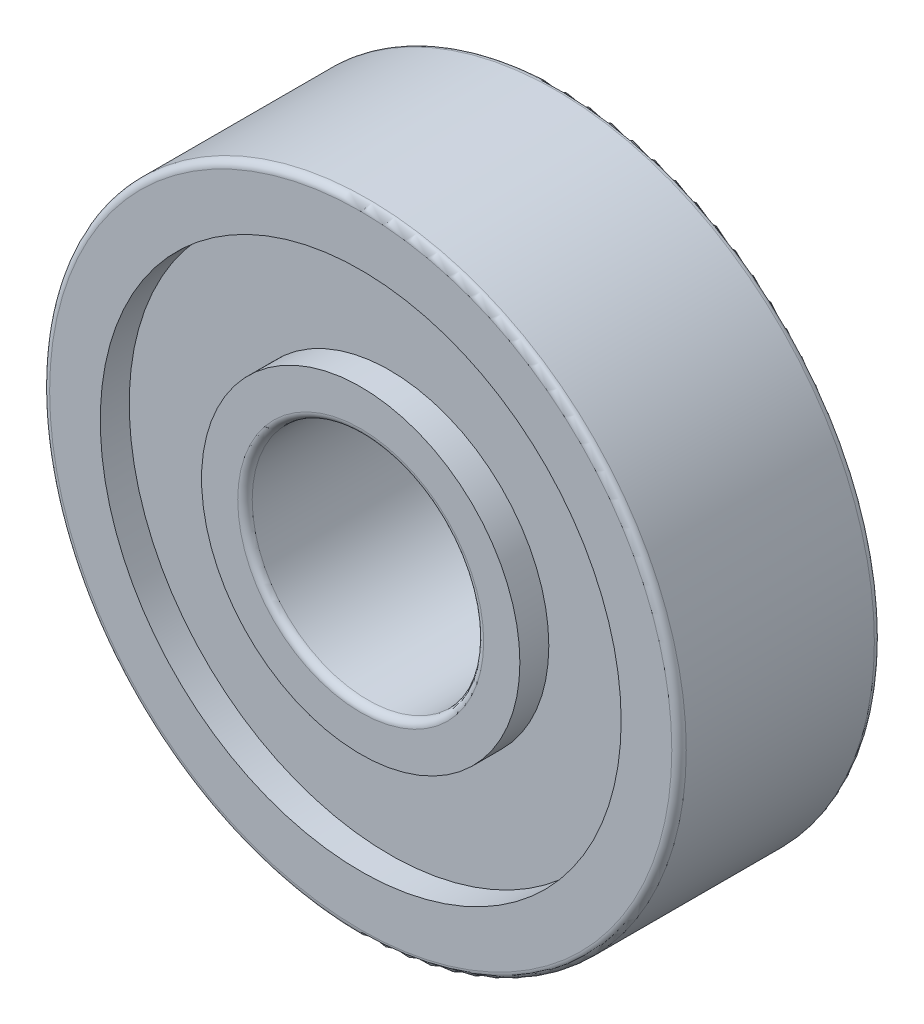
ISO-10303-21;
HEADER;
FILE_DESCRIPTION(('STEP AP214'),'2;1');
FILE_NAME('part.step','',(''),(''),'','','');
FILE_SCHEMA(('AUTOMOTIVE_DESIGN { 1 0 10303 214 1 1 1 1 }'));
ENDSEC;
DATA;
#1=APPLICATION_CONTEXT('core data for automotive mechanical design processes');
#2=APPLICATION_PROTOCOL_DEFINITION('international standard','automotive_design',2000,#1);
#3=PRODUCT_CONTEXT('',#1,'mechanical');
#4=PRODUCT('Part','Part','',(#3));
#5=PRODUCT_RELATED_PRODUCT_CATEGORY('part','',(#4));
#6=PRODUCT_DEFINITION_FORMATION('','',#4);
#7=PRODUCT_DEFINITION_CONTEXT('part definition',#1,'design');
#8=PRODUCT_DEFINITION('design','',#6,#7);
#9=PRODUCT_DEFINITION_SHAPE('','',#8);
#10=(LENGTH_UNIT() NAMED_UNIT(*) SI_UNIT(.MILLI.,.METRE.));
#11=(NAMED_UNIT(*) PLANE_ANGLE_UNIT() SI_UNIT($,.RADIAN.));
#12=(NAMED_UNIT(*) SI_UNIT($,.STERADIAN.) SOLID_ANGLE_UNIT());
#13=UNCERTAINTY_MEASURE_WITH_UNIT(LENGTH_MEASURE(1.E-05),#10,'distance_accuracy_value','');
#14=(GEOMETRIC_REPRESENTATION_CONTEXT(3) GLOBAL_UNCERTAINTY_ASSIGNED_CONTEXT((#13)) GLOBAL_UNIT_ASSIGNED_CONTEXT((#10,
#11,#12)) REPRESENTATION_CONTEXT('',''));
#15=CARTESIAN_POINT('',(0.,0.,0.));
#16=DIRECTION('',(0.,0.,1.));
#17=DIRECTION('',(1.,0.,0.));
#18=AXIS2_PLACEMENT_3D('',#15,#16,#17);
#19=CARTESIAN_POINT('',(0.,0.,0.));
#20=DIRECTION('',(0.,0.,1.));
#21=DIRECTION('',(1.,0.,0.));
#22=AXIS2_PLACEMENT_3D('',#19,#20,#21);
#23=PLANE('',#22);
#24=CARTESIAN_POINT('',(0.,0.,0.));
#25=DIRECTION('',(0.,0.,1.));
#26=DIRECTION('',(1.,0.,0.));
#27=AXIS2_PLACEMENT_3D('',#24,#25,#26);
#28=CIRCLE('',#27,4.25);
#29=CARTESIAN_POINT('',(4.25,0.,0.));
#30=VERTEX_POINT('',#29);
#31=EDGE_CURVE('E54',#30,#30,#28,.T.);
#32=ORIENTED_EDGE('',*,*,#31,.T.);
#33=EDGE_LOOP('',(#32));
#34=FACE_BOUND('',#33,.T.);
#35=CARTESIAN_POINT('',(0.,0.,0.));
#36=DIRECTION('',(0.,0.,-1.));
#37=DIRECTION('',(-1.,0.,0.));
#38=AXIS2_PLACEMENT_3D('',#35,#36,#37);
#39=CIRCLE('',#38,5.5);
#40=CARTESIAN_POINT('',(-5.5,0.,0.));
#41=VERTEX_POINT('',#40);
#42=EDGE_CURVE('E79',#41,#41,#39,.T.);
#43=ORIENTED_EDGE('',*,*,#42,.T.);
#44=EDGE_LOOP('',(#43));
#45=FACE_BOUND('',#44,.T.);
#46=ADVANCED_FACE('F28',(#34,#45),#23,.F.);
#47=CARTESIAN_POINT('',(0.,0.,7.));
#48=DIRECTION('',(0.,0.,1.));
#49=DIRECTION('',(1.,0.,0.));
#50=AXIS2_PLACEMENT_3D('',#47,#48,#49);
#51=PLANE('',#50);
#52=CARTESIAN_POINT('',(0.,0.,7.));
#53=DIRECTION('',(0.,0.,1.));
#54=DIRECTION('',(1.,0.,0.));
#55=AXIS2_PLACEMENT_3D('',#52,#53,#54);
#56=CIRCLE('',#55,4.25);
#57=CARTESIAN_POINT('',(4.25,0.,7.));
#58=VERTEX_POINT('',#57);
#59=EDGE_CURVE('E39',#58,#58,#56,.F.);
#60=ORIENTED_EDGE('',*,*,#59,.T.);
#61=EDGE_LOOP('',(#60));
#62=FACE_BOUND('',#61,.T.);
#63=CARTESIAN_POINT('',(0.,0.,7.));
#64=DIRECTION('',(0.,0.,1.));
#65=DIRECTION('',(1.,0.,0.));
#66=AXIS2_PLACEMENT_3D('',#63,#64,#65);
#67=CIRCLE('',#66,5.5);
#68=CARTESIAN_POINT('',(5.5,0.,7.));
#69=VERTEX_POINT('',#68);
#70=EDGE_CURVE('E67',#69,#69,#67,.T.);
#71=ORIENTED_EDGE('',*,*,#70,.T.);
#72=EDGE_LOOP('',(#71));
#73=FACE_BOUND('',#72,.T.);
#74=ADVANCED_FACE('F123',(#62,#73),#51,.T.);
#75=CARTESIAN_POINT('',(0.,0.,7.));
#76=DIRECTION('',(0.,0.,1.));
#77=DIRECTION('',(1.,0.,0.));
#78=AXIS2_PLACEMENT_3D('',#75,#76,#77);
#79=CIRCLE('',#78,9.);
#80=CARTESIAN_POINT('',(9.,0.,7.));
#81=VERTEX_POINT('',#80);
#82=EDGE_CURVE('E61',#81,#81,#79,.T.);
#83=ORIENTED_EDGE('',*,*,#82,.F.);
#84=EDGE_LOOP('',(#83));
#85=FACE_BOUND('',#84,.T.);
#86=CARTESIAN_POINT('',(0.,0.,7.));
#87=DIRECTION('',(0.,0.,1.));
#88=DIRECTION('',(1.,0.,0.));
#89=AXIS2_PLACEMENT_3D('',#86,#87,#88);
#90=CIRCLE('',#89,10.75);
#91=CARTESIAN_POINT('',(10.75,0.,7.));
#92=VERTEX_POINT('',#91);
#93=EDGE_CURVE('E43',#92,#92,#90,.T.);
#94=ORIENTED_EDGE('',*,*,#93,.T.);
#95=EDGE_LOOP('',(#94));
#96=FACE_BOUND('',#95,.T.);
#97=ADVANCED_FACE('F105',(#85,#96),#51,.T.);
#98=CARTESIAN_POINT('',(0.,0.,0.));
#99=DIRECTION('',(0.,0.,-1.));
#100=DIRECTION('',(-1.,0.,0.));
#101=AXIS2_PLACEMENT_3D('',#98,#99,#100);
#102=CIRCLE('',#101,9.);
#103=CARTESIAN_POINT('',(-9.,0.,0.));
#104=VERTEX_POINT('',#103);
#105=EDGE_CURVE('E73',#104,#104,#102,.T.);
#106=ORIENTED_EDGE('',*,*,#105,.F.);
#107=EDGE_LOOP('',(#106));
#108=FACE_BOUND('',#107,.T.);
#109=CARTESIAN_POINT('',(0.,0.,0.));
#110=DIRECTION('',(0.,0.,1.));
#111=DIRECTION('',(1.,0.,0.));
#112=AXIS2_PLACEMENT_3D('',#109,#110,#111);
#113=CIRCLE('',#112,10.75);
#114=CARTESIAN_POINT('',(10.75,0.,0.));
#115=VERTEX_POINT('',#114);
#116=EDGE_CURVE('E57',#115,#115,#113,.F.);
#117=ORIENTED_EDGE('',*,*,#116,.T.);
#118=EDGE_LOOP('',(#117));
#119=FACE_BOUND('',#118,.T.);
#120=ADVANCED_FACE('F101',(#108,#119),#23,.F.);
#121=CARTESIAN_POINT('',(0.,0.,7.));
#122=DIRECTION('',(0.,0.,-1.));
#123=DIRECTION('',(-1.,0.,0.));
#124=AXIS2_PLACEMENT_3D('',#121,#122,#123);
#125=CYLINDRICAL_SURFACE('',#124,11.);
#126=CARTESIAN_POINT('',(0.,0.,0.25));
#127=DIRECTION('',(0.,0.,1.));
#128=DIRECTION('',(1.,0.,0.));
#129=AXIS2_PLACEMENT_3D('',#126,#127,#128);
#130=CIRCLE('',#129,11.);
#131=CARTESIAN_POINT('',(11.,0.,0.25));
#132=VERTEX_POINT('',#131);
#133=EDGE_CURVE('E10',#132,#132,#130,.T.);
#134=ORIENTED_EDGE('',*,*,#133,.T.);
#135=EDGE_LOOP('',(#134));
#136=FACE_BOUND('',#135,.T.);
#137=CARTESIAN_POINT('',(0.,0.,6.75));
#138=DIRECTION('',(0.,0.,1.));
#139=DIRECTION('',(1.,0.,0.));
#140=AXIS2_PLACEMENT_3D('',#137,#138,#139);
#141=CIRCLE('',#140,11.);
#142=CARTESIAN_POINT('',(11.,0.,6.75));
#143=VERTEX_POINT('',#142);
#144=EDGE_CURVE('E35',#143,#143,#141,.F.);
#145=ORIENTED_EDGE('',*,*,#144,.T.);
#146=EDGE_LOOP('',(#145));
#147=FACE_BOUND('',#146,.T.);
#148=ADVANCED_FACE('F104',(#136,#147),#125,.T.);
#149=CARTESIAN_POINT('',(0.,0.,7.));
#150=DIRECTION('',(0.,0.,-1.));
#151=DIRECTION('',(-1.,0.,0.));
#152=AXIS2_PLACEMENT_3D('',#149,#150,#151);
#153=CYLINDRICAL_SURFACE('',#152,4.);
#154=CARTESIAN_POINT('',(0.,0.,0.25));
#155=DIRECTION('',(0.,0.,1.));
#156=DIRECTION('',(1.,0.,0.));
#157=AXIS2_PLACEMENT_3D('',#154,#155,#156);
#158=CIRCLE('',#157,4.);
#159=CARTESIAN_POINT('',(4.,0.,0.25));
#160=VERTEX_POINT('',#159);
#161=EDGE_CURVE('E48',#160,#160,#158,.F.);
#162=ORIENTED_EDGE('',*,*,#161,.T.);
#163=EDGE_LOOP('',(#162));
#164=FACE_BOUND('',#163,.T.);
#165=CARTESIAN_POINT('',(0.,0.,6.75));
#166=DIRECTION('',(0.,0.,1.));
#167=DIRECTION('',(1.,0.,0.));
#168=AXIS2_PLACEMENT_3D('',#165,#166,#167);
#169=CIRCLE('',#168,4.);
#170=CARTESIAN_POINT('',(4.,0.,6.75));
#171=VERTEX_POINT('',#170);
#172=EDGE_CURVE('E51',#171,#171,#169,.T.);
#173=ORIENTED_EDGE('',*,*,#172,.T.);
#174=EDGE_LOOP('',(#173));
#175=FACE_BOUND('',#174,.T.);
#176=ADVANCED_FACE('F135',(#164,#175),#153,.F.);
#177=CARTESIAN_POINT('',(0.,0.,0.25));
#178=DIRECTION('',(0.,0.,1.));
#179=DIRECTION('',(1.,0.,0.));
#180=AXIS2_PLACEMENT_3D('',#177,#178,#179);
#181=TOROIDAL_SURFACE('',#180,4.25,0.25);
#182=ORIENTED_EDGE('',*,*,#161,.F.);
#183=EDGE_LOOP('',(#182));
#184=FACE_BOUND('',#183,.T.);
#185=ORIENTED_EDGE('',*,*,#31,.F.);
#186=EDGE_LOOP('',(#185));
#187=FACE_BOUND('',#186,.T.);
#188=ADVANCED_FACE('F119',(#184,#187),#181,.T.);
#189=CARTESIAN_POINT('',(0.,0.,6.75));
#190=DIRECTION('',(0.,0.,1.));
#191=DIRECTION('',(1.,0.,0.));
#192=AXIS2_PLACEMENT_3D('',#189,#190,#191);
#193=TOROIDAL_SURFACE('',#192,4.25,0.25);
#194=ORIENTED_EDGE('',*,*,#59,.F.);
#195=EDGE_LOOP('',(#194));
#196=FACE_BOUND('',#195,.T.);
#197=ORIENTED_EDGE('',*,*,#172,.F.);
#198=EDGE_LOOP('',(#197));
#199=FACE_BOUND('',#198,.T.);
#200=ADVANCED_FACE('F112',(#196,#199),#193,.T.);
#201=CARTESIAN_POINT('',(0.,0.,0.25));
#202=DIRECTION('',(0.,0.,1.));
#203=DIRECTION('',(1.,0.,0.));
#204=AXIS2_PLACEMENT_3D('',#201,#202,#203);
#205=TOROIDAL_SURFACE('',#204,10.75,0.25);
#206=ORIENTED_EDGE('',*,*,#116,.F.);
#207=EDGE_LOOP('',(#206));
#208=FACE_BOUND('',#207,.T.);
#209=ORIENTED_EDGE('',*,*,#133,.F.);
#210=EDGE_LOOP('',(#209));
#211=FACE_BOUND('',#210,.T.);
#212=ADVANCED_FACE('F109',(#208,#211),#205,.T.);
#213=CARTESIAN_POINT('',(0.,0.,6.75));
#214=DIRECTION('',(0.,0.,1.));
#215=DIRECTION('',(1.,0.,0.));
#216=AXIS2_PLACEMENT_3D('',#213,#214,#215);
#217=TOROIDAL_SURFACE('',#216,10.75,0.25);
#218=ORIENTED_EDGE('',*,*,#144,.F.);
#219=EDGE_LOOP('',(#218));
#220=FACE_BOUND('',#219,.T.);
#221=ORIENTED_EDGE('',*,*,#93,.F.);
#222=EDGE_LOOP('',(#221));
#223=FACE_BOUND('',#222,.T.);
#224=ADVANCED_FACE('F30',(#220,#223),#217,.T.);
#225=CARTESIAN_POINT('',(0.,0.,6.));
#226=DIRECTION('',(0.,0.,1.));
#227=DIRECTION('',(1.,0.,0.));
#228=AXIS2_PLACEMENT_3D('',#225,#226,#227);
#229=CYLINDRICAL_SURFACE('',#228,9.);
#230=CARTESIAN_POINT('',(0.,0.,6.));
#231=DIRECTION('',(0.,0.,1.));
#232=DIRECTION('',(1.,0.,0.));
#233=AXIS2_PLACEMENT_3D('',#230,#231,#232);
#234=CIRCLE('',#233,9.);
#235=CARTESIAN_POINT('',(9.,0.,6.));
#236=VERTEX_POINT('',#235);
#237=EDGE_CURVE('E60',#236,#236,#234,.T.);
#238=ORIENTED_EDGE('',*,*,#237,.F.);
#239=EDGE_LOOP('',(#238));
#240=FACE_BOUND('',#239,.T.);
#241=ORIENTED_EDGE('',*,*,#82,.T.);
#242=EDGE_LOOP('',(#241));
#243=FACE_BOUND('',#242,.T.);
#244=ADVANCED_FACE('F117',(#240,#243),#229,.F.);
#245=CARTESIAN_POINT('',(0.,0.,6.));
#246=DIRECTION('',(0.,0.,1.));
#247=DIRECTION('',(1.,0.,0.));
#248=AXIS2_PLACEMENT_3D('',#245,#246,#247);
#249=PLANE('',#248);
#250=CARTESIAN_POINT('',(0.,0.,6.));
#251=DIRECTION('',(0.,0.,1.));
#252=DIRECTION('',(1.,0.,0.));
#253=AXIS2_PLACEMENT_3D('',#250,#251,#252);
#254=CIRCLE('',#253,5.5);
#255=CARTESIAN_POINT('',(5.5,0.,6.));
#256=VERTEX_POINT('',#255);
#257=EDGE_CURVE('E64',#256,#256,#254,.T.);
#258=ORIENTED_EDGE('',*,*,#257,.F.);
#259=EDGE_LOOP('',(#258));
#260=FACE_BOUND('',#259,.T.);
#261=ORIENTED_EDGE('',*,*,#237,.T.);
#262=EDGE_LOOP('',(#261));
#263=FACE_BOUND('',#262,.T.);
#264=ADVANCED_FACE('F153',(#260,#263),#249,.T.);
#265=CARTESIAN_POINT('',(0.,0.,6.));
#266=DIRECTION('',(0.,0.,1.));
#267=DIRECTION('',(1.,0.,0.));
#268=AXIS2_PLACEMENT_3D('',#265,#266,#267);
#269=CYLINDRICAL_SURFACE('',#268,5.5);
#270=ORIENTED_EDGE('',*,*,#257,.T.);
#271=EDGE_LOOP('',(#270));
#272=FACE_BOUND('',#271,.T.);
#273=ORIENTED_EDGE('',*,*,#70,.F.);
#274=EDGE_LOOP('',(#273));
#275=FACE_BOUND('',#274,.T.);
#276=ADVANCED_FACE('F97',(#272,#275),#269,.T.);
#277=CARTESIAN_POINT('',(0.,0.,1.));
#278=DIRECTION('',(0.,0.,-1.));
#279=DIRECTION('',(-1.,0.,0.));
#280=AXIS2_PLACEMENT_3D('',#277,#278,#279);
#281=CYLINDRICAL_SURFACE('',#280,9.);
#282=CARTESIAN_POINT('',(0.,0.,1.));
#283=DIRECTION('',(0.,0.,-1.));
#284=DIRECTION('',(-1.,0.,0.));
#285=AXIS2_PLACEMENT_3D('',#282,#283,#284);
#286=CIRCLE('',#285,9.);
#287=CARTESIAN_POINT('',(-9.,0.,1.));
#288=VERTEX_POINT('',#287);
#289=EDGE_CURVE('E70',#288,#288,#286,.T.);
#290=ORIENTED_EDGE('',*,*,#289,.F.);
#291=EDGE_LOOP('',(#290));
#292=FACE_BOUND('',#291,.T.);
#293=ORIENTED_EDGE('',*,*,#105,.T.);
#294=EDGE_LOOP('',(#293));
#295=FACE_BOUND('',#294,.T.);
#296=ADVANCED_FACE('F91',(#292,#295),#281,.F.);
#297=CARTESIAN_POINT('',(0.,0.,1.));
#298=DIRECTION('',(0.,0.,-1.));
#299=DIRECTION('',(-1.,0.,0.));
#300=AXIS2_PLACEMENT_3D('',#297,#298,#299);
#301=PLANE('',#300);
#302=CARTESIAN_POINT('',(0.,0.,1.));
#303=DIRECTION('',(0.,0.,-1.));
#304=DIRECTION('',(-1.,0.,0.));
#305=AXIS2_PLACEMENT_3D('',#302,#303,#304);
#306=CIRCLE('',#305,5.5);
#307=CARTESIAN_POINT('',(-5.5,0.,1.));
#308=VERTEX_POINT('',#307);
#309=EDGE_CURVE('E76',#308,#308,#306,.T.);
#310=ORIENTED_EDGE('',*,*,#309,.F.);
#311=EDGE_LOOP('',(#310));
#312=FACE_BOUND('',#311,.T.);
#313=ORIENTED_EDGE('',*,*,#289,.T.);
#314=EDGE_LOOP('',(#313));
#315=FACE_BOUND('',#314,.T.);
#316=ADVANCED_FACE('F88',(#312,#315),#301,.T.);
#317=CARTESIAN_POINT('',(0.,0.,1.));
#318=DIRECTION('',(0.,0.,-1.));
#319=DIRECTION('',(-1.,0.,0.));
#320=AXIS2_PLACEMENT_3D('',#317,#318,#319);
#321=CYLINDRICAL_SURFACE('',#320,5.5);
#322=ORIENTED_EDGE('',*,*,#309,.T.);
#323=EDGE_LOOP('',(#322));
#324=FACE_BOUND('',#323,.T.);
#325=ORIENTED_EDGE('',*,*,#42,.F.);
#326=EDGE_LOOP('',(#325));
#327=FACE_BOUND('',#326,.T.);
#328=ADVANCED_FACE('F85',(#324,#327),#321,.T.);
#329=CLOSED_SHELL('',(#46,#74,#97,#120,#148,#176,#188,#200,#212,#224,#244,#264,#276,#296,#316,#328));
#330=MANIFOLD_SOLID_BREP('B2',#329);
#331=ADVANCED_BREP_SHAPE_REPRESENTATION('',(#18,#330),#14);
#332=SHAPE_DEFINITION_REPRESENTATION(#9,#331);
ENDSEC;
END-ISO-10303-21;
